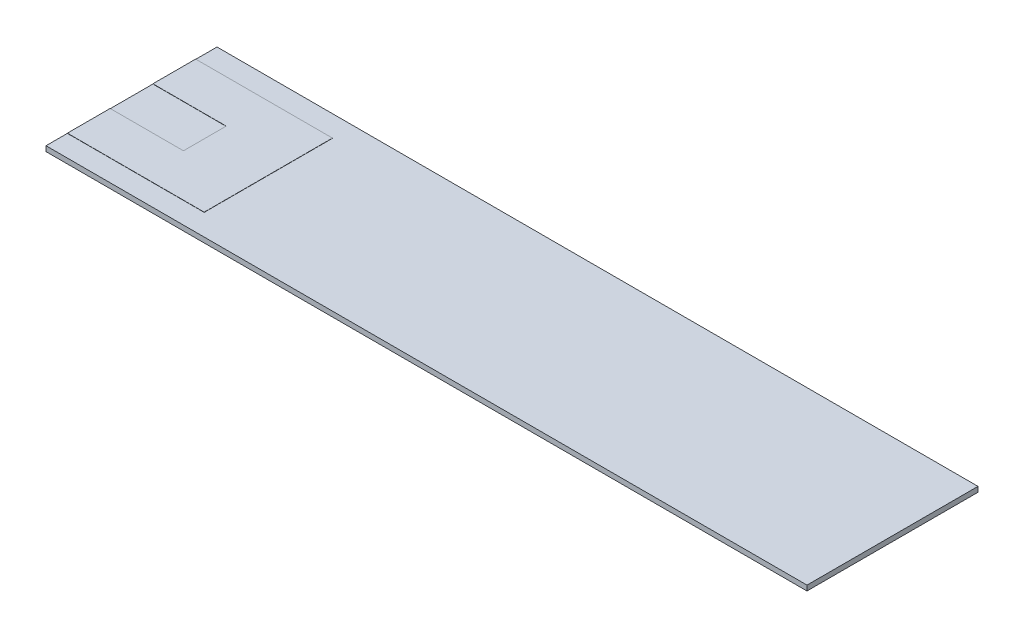
ISO-10303-21;
HEADER;
FILE_DESCRIPTION(('STEP AP214'),'2;1');
FILE_NAME('part.step','',(''),(''),'','','');
FILE_SCHEMA(('AUTOMOTIVE_DESIGN { 1 0 10303 214 1 1 1 1 }'));
ENDSEC;
DATA;
#1=APPLICATION_CONTEXT('core data for automotive mechanical design processes');
#2=APPLICATION_PROTOCOL_DEFINITION('international standard','automotive_design',2000,#1);
#3=PRODUCT_CONTEXT('',#1,'mechanical');
#4=PRODUCT('Part','Part','',(#3));
#5=PRODUCT_RELATED_PRODUCT_CATEGORY('part','',(#4));
#6=PRODUCT_DEFINITION_FORMATION('','',#4);
#7=PRODUCT_DEFINITION_CONTEXT('part definition',#1,'design');
#8=PRODUCT_DEFINITION('design','',#6,#7);
#9=PRODUCT_DEFINITION_SHAPE('','',#8);
#10=(LENGTH_UNIT() NAMED_UNIT(*) SI_UNIT(.MILLI.,.METRE.));
#11=(NAMED_UNIT(*) PLANE_ANGLE_UNIT() SI_UNIT($,.RADIAN.));
#12=(NAMED_UNIT(*) SI_UNIT($,.STERADIAN.) SOLID_ANGLE_UNIT());
#13=UNCERTAINTY_MEASURE_WITH_UNIT(LENGTH_MEASURE(1.E-05),#10,'distance_accuracy_value','');
#14=(GEOMETRIC_REPRESENTATION_CONTEXT(3) GLOBAL_UNCERTAINTY_ASSIGNED_CONTEXT((#13)) GLOBAL_UNIT_ASSIGNED_CONTEXT((#10,
#11,#12)) REPRESENTATION_CONTEXT('',''));
#15=CARTESIAN_POINT('',(0.,0.,0.));
#16=DIRECTION('',(0.,0.,1.));
#17=DIRECTION('',(1.,0.,0.));
#18=AXIS2_PLACEMENT_3D('',#15,#16,#17);
#19=CARTESIAN_POINT('',(0.,0.0001,0.));
#20=DIRECTION('',(0.,1.,0.));
#21=DIRECTION('',(0.,0.,1.));
#22=AXIS2_PLACEMENT_3D('',#19,#20,#21);
#23=PLANE('',#22);
#24=DIRECTION('',(-1.,0.,0.));
#25=VECTOR('',#24,1.);
#26=CARTESIAN_POINT('',(30.,0.0001,-3.75));
#27=LINE('',#26,#25);
#28=CARTESIAN_POINT('',(38.,0.0001,-3.75));
#29=VERTEX_POINT('',#28);
#30=CARTESIAN_POINT('',(30.,0.0001,-3.75));
#31=VERTEX_POINT('',#30);
#32=EDGE_CURVE('E50',#29,#31,#27,.T.);
#33=ORIENTED_EDGE('',*,*,#32,.F.);
#34=DIRECTION('',(0.,0.,-1.));
#35=VECTOR('',#34,1.);
#36=CARTESIAN_POINT('',(38.,0.0001,-3.75));
#37=LINE('',#36,#35);
#38=CARTESIAN_POINT('',(38.,0.0001,3.75));
#39=VERTEX_POINT('',#38);
#40=EDGE_CURVE('E54',#39,#29,#37,.T.);
#41=ORIENTED_EDGE('',*,*,#40,.F.);
#42=DIRECTION('',(1.,0.,0.));
#43=VECTOR('',#42,1.);
#44=CARTESIAN_POINT('',(38.,0.0001,3.75));
#45=LINE('',#44,#43);
#46=CARTESIAN_POINT('',(30.,0.0001,3.75));
#47=VERTEX_POINT('',#46);
#48=EDGE_CURVE('E197',#47,#39,#45,.T.);
#49=ORIENTED_EDGE('',*,*,#48,.F.);
#50=DIRECTION('',(0.,0.,1.));
#51=VECTOR('',#50,1.);
#52=CARTESIAN_POINT('',(30.,0.0001,-5.));
#53=LINE('',#52,#51);
#54=CARTESIAN_POINT('',(30.,0.0001,5.));
#55=VERTEX_POINT('',#54);
#56=EDGE_CURVE('E162',#47,#55,#53,.T.);
#57=ORIENTED_EDGE('',*,*,#56,.T.);
#58=DIRECTION('',(1.,0.,0.));
#59=VECTOR('',#58,1.);
#60=CARTESIAN_POINT('',(30.,0.0001,5.));
#61=LINE('',#60,#59);
#62=CARTESIAN_POINT('',(74.5,0.0001,5.));
#63=VERTEX_POINT('',#62);
#64=EDGE_CURVE('E165',#55,#63,#61,.T.);
#65=ORIENTED_EDGE('',*,*,#64,.T.);
#66=DIRECTION('',(0.,0.,-1.));
#67=VECTOR('',#66,1.);
#68=CARTESIAN_POINT('',(74.5,0.0001,-5.));
#69=LINE('',#68,#67);
#70=CARTESIAN_POINT('',(74.5,0.0001,-5.));
#71=VERTEX_POINT('',#70);
#72=EDGE_CURVE('E167',#63,#71,#69,.T.);
#73=ORIENTED_EDGE('',*,*,#72,.T.);
#74=DIRECTION('',(-1.,0.,0.));
#75=VECTOR('',#74,1.);
#76=CARTESIAN_POINT('',(30.,0.0001,-5.));
#77=LINE('',#76,#75);
#78=CARTESIAN_POINT('',(30.,0.0001,-5.));
#79=VERTEX_POINT('',#78);
#80=EDGE_CURVE('E169',#71,#79,#77,.T.);
#81=ORIENTED_EDGE('',*,*,#80,.T.);
#82=EDGE_CURVE('E163',#79,#31,#53,.T.);
#83=ORIENTED_EDGE('',*,*,#82,.T.);
#84=EDGE_LOOP('',(#33,#41,#49,#57,#65,#73,#81,#83));
#85=FACE_BOUND('',#84,.T.);
#86=ADVANCED_FACE('F35',(#85),#23,.T.);
#87=CARTESIAN_POINT('',(30.,0.0001,-5.));
#88=DIRECTION('',(1.,0.,0.));
#89=DIRECTION('',(0.,0.,-1.));
#90=AXIS2_PLACEMENT_3D('',#87,#88,#89);
#91=PLANE('',#90);
#92=DIRECTION('',(0.,-1.,0.));
#93=VECTOR('',#92,1.);
#94=CARTESIAN_POINT('',(30.,0.0001,-5.));
#95=LINE('',#94,#93);
#96=CARTESIAN_POINT('',(30.,-0.3,-5.));
#97=VERTEX_POINT('',#96);
#98=EDGE_CURVE('E171',#79,#97,#95,.T.);
#99=ORIENTED_EDGE('',*,*,#98,.T.);
#100=DIRECTION('',(0.,0.,1.));
#101=VECTOR('',#100,1.);
#102=CARTESIAN_POINT('',(30.,-0.3,-5.));
#103=LINE('',#102,#101);
#104=CARTESIAN_POINT('',(30.,-0.3,5.));
#105=VERTEX_POINT('',#104);
#106=EDGE_CURVE('E145',#97,#105,#103,.T.);
#107=ORIENTED_EDGE('',*,*,#106,.T.);
#108=DIRECTION('',(0.,-1.,0.));
#109=VECTOR('',#108,1.);
#110=CARTESIAN_POINT('',(30.,0.0001,5.));
#111=LINE('',#110,#109);
#112=EDGE_CURVE('E11',#55,#105,#111,.T.);
#113=ORIENTED_EDGE('',*,*,#112,.F.);
#114=ORIENTED_EDGE('',*,*,#56,.F.);
#115=DIRECTION('',(0.,-1.,0.));
#116=VECTOR('',#115,1.);
#117=CARTESIAN_POINT('',(30.,0.0127,3.75));
#118=LINE('',#117,#116);
#119=CARTESIAN_POINT('',(30.,0.0127,3.75));
#120=VERTEX_POINT('',#119);
#121=EDGE_CURVE('E215',#120,#47,#118,.T.);
#122=ORIENTED_EDGE('',*,*,#121,.F.);
#123=DIRECTION('',(0.,0.,1.));
#124=VECTOR('',#123,1.);
#125=CARTESIAN_POINT('',(30.,0.0127,1.25));
#126=LINE('',#125,#124);
#127=CARTESIAN_POINT('',(30.,0.0127,1.25));
#128=VERTEX_POINT('',#127);
#129=EDGE_CURVE('E214',#128,#120,#126,.T.);
#130=ORIENTED_EDGE('',*,*,#129,.F.);
#131=DIRECTION('',(0.,-1.,0.));
#132=VECTOR('',#131,1.);
#133=CARTESIAN_POINT('',(30.,0.0127,1.25));
#134=LINE('',#133,#132);
#135=CARTESIAN_POINT('',(30.,0.0001,1.25));
#136=VERTEX_POINT('',#135);
#137=EDGE_CURVE('E209',#128,#136,#134,.T.);
#138=ORIENTED_EDGE('',*,*,#137,.T.);
#139=CARTESIAN_POINT('',(30.,0.0001,-1.25));
#140=VERTEX_POINT('',#139);
#141=EDGE_CURVE('E144',#140,#136,#53,.T.);
#142=ORIENTED_EDGE('',*,*,#141,.F.);
#143=DIRECTION('',(0.,-1.,0.));
#144=VECTOR('',#143,1.);
#145=CARTESIAN_POINT('',(30.,0.0127,-1.25));
#146=LINE('',#145,#144);
#147=CARTESIAN_POINT('',(30.,0.0127,-1.25));
#148=VERTEX_POINT('',#147);
#149=EDGE_CURVE('E126',#148,#140,#146,.T.);
#150=ORIENTED_EDGE('',*,*,#149,.F.);
#151=DIRECTION('',(0.,0.,1.));
#152=VECTOR('',#151,1.);
#153=CARTESIAN_POINT('',(30.,0.0127,-3.75));
#154=LINE('',#153,#152);
#155=CARTESIAN_POINT('',(30.,0.0127,-3.75));
#156=VERTEX_POINT('',#155);
#157=EDGE_CURVE('E132',#156,#148,#154,.T.);
#158=ORIENTED_EDGE('',*,*,#157,.F.);
#159=DIRECTION('',(0.,-1.,0.));
#160=VECTOR('',#159,1.);
#161=CARTESIAN_POINT('',(30.,0.0127,-3.75));
#162=LINE('',#161,#160);
#163=EDGE_CURVE('E225',#156,#31,#162,.T.);
#164=ORIENTED_EDGE('',*,*,#163,.T.);
#165=ORIENTED_EDGE('',*,*,#82,.F.);
#166=EDGE_LOOP('',(#99,#107,#113,#114,#122,#130,#138,#142,#150,#158,#164,#165));
#167=FACE_BOUND('',#166,.T.);
#168=ADVANCED_FACE('F37',(#167),#91,.F.);
#169=CARTESIAN_POINT('',(30.,0.0001,5.));
#170=DIRECTION('',(0.,0.,-1.));
#171=DIRECTION('',(-1.,0.,0.));
#172=AXIS2_PLACEMENT_3D('',#169,#170,#171);
#173=PLANE('',#172);
#174=ORIENTED_EDGE('',*,*,#112,.T.);
#175=DIRECTION('',(1.,0.,0.));
#176=VECTOR('',#175,1.);
#177=CARTESIAN_POINT('',(30.,-0.3,5.));
#178=LINE('',#177,#176);
#179=CARTESIAN_POINT('',(74.5,-0.3,5.));
#180=VERTEX_POINT('',#179);
#181=EDGE_CURVE('E148',#105,#180,#178,.T.);
#182=ORIENTED_EDGE('',*,*,#181,.T.);
#183=DIRECTION('',(0.,-1.,0.));
#184=VECTOR('',#183,1.);
#185=CARTESIAN_POINT('',(74.5,0.0001,5.));
#186=LINE('',#185,#184);
#187=EDGE_CURVE('E43',#63,#180,#186,.T.);
#188=ORIENTED_EDGE('',*,*,#187,.F.);
#189=ORIENTED_EDGE('',*,*,#64,.F.);
#190=EDGE_LOOP('',(#174,#182,#188,#189));
#191=FACE_BOUND('',#190,.T.);
#192=ADVANCED_FACE('F187',(#191),#173,.F.);
#193=CARTESIAN_POINT('',(74.5,0.0001,-5.));
#194=DIRECTION('',(-1.,0.,0.));
#195=DIRECTION('',(0.,0.,1.));
#196=AXIS2_PLACEMENT_3D('',#193,#194,#195);
#197=PLANE('',#196);
#198=ORIENTED_EDGE('',*,*,#187,.T.);
#199=DIRECTION('',(0.,0.,-1.));
#200=VECTOR('',#199,1.);
#201=CARTESIAN_POINT('',(74.5,-0.3,-5.));
#202=LINE('',#201,#200);
#203=CARTESIAN_POINT('',(74.5,-0.3,-5.));
#204=VERTEX_POINT('',#203);
#205=EDGE_CURVE('E156',#180,#204,#202,.T.);
#206=ORIENTED_EDGE('',*,*,#205,.T.);
#207=DIRECTION('',(0.,-1.,0.));
#208=VECTOR('',#207,1.);
#209=CARTESIAN_POINT('',(74.5,0.0001,-5.));
#210=LINE('',#209,#208);
#211=EDGE_CURVE('E173',#71,#204,#210,.T.);
#212=ORIENTED_EDGE('',*,*,#211,.F.);
#213=ORIENTED_EDGE('',*,*,#72,.F.);
#214=EDGE_LOOP('',(#198,#206,#212,#213));
#215=FACE_BOUND('',#214,.T.);
#216=ADVANCED_FACE('F178',(#215),#197,.F.);
#217=CARTESIAN_POINT('',(30.,0.0001,-5.));
#218=DIRECTION('',(0.,0.,1.));
#219=DIRECTION('',(1.,0.,0.));
#220=AXIS2_PLACEMENT_3D('',#217,#218,#219);
#221=PLANE('',#220);
#222=ORIENTED_EDGE('',*,*,#211,.T.);
#223=DIRECTION('',(-1.,0.,0.));
#224=VECTOR('',#223,1.);
#225=CARTESIAN_POINT('',(30.,-0.3,-5.));
#226=LINE('',#225,#224);
#227=EDGE_CURVE('E159',#204,#97,#226,.T.);
#228=ORIENTED_EDGE('',*,*,#227,.T.);
#229=ORIENTED_EDGE('',*,*,#98,.F.);
#230=ORIENTED_EDGE('',*,*,#80,.F.);
#231=EDGE_LOOP('',(#222,#228,#229,#230));
#232=FACE_BOUND('',#231,.T.);
#233=ADVANCED_FACE('F195',(#232),#221,.F.);
#234=DIRECTION('',(-1.,0.,0.));
#235=VECTOR('',#234,1.);
#236=CARTESIAN_POINT('',(30.,0.0001,1.25));
#237=LINE('',#236,#235);
#238=CARTESIAN_POINT('',(34.2882611147377,0.0001,1.25));
#239=VERTEX_POINT('',#238);
#240=EDGE_CURVE('E201',#239,#136,#237,.T.);
#241=ORIENTED_EDGE('',*,*,#240,.F.);
#242=DIRECTION('',(0.,0.,1.));
#243=VECTOR('',#242,1.);
#244=CARTESIAN_POINT('',(34.2882611147377,0.0001,1.25));
#245=LINE('',#244,#243);
#246=CARTESIAN_POINT('',(34.2882611147377,0.0001,-1.25));
#247=VERTEX_POINT('',#246);
#248=EDGE_CURVE('E212',#247,#239,#245,.T.);
#249=ORIENTED_EDGE('',*,*,#248,.F.);
#250=DIRECTION('',(1.,0.,0.));
#251=VECTOR('',#250,1.);
#252=CARTESIAN_POINT('',(34.2882611147377,0.0001,-1.25));
#253=LINE('',#252,#251);
#254=EDGE_CURVE('E203',#140,#247,#253,.T.);
#255=ORIENTED_EDGE('',*,*,#254,.F.);
#256=ORIENTED_EDGE('',*,*,#141,.T.);
#257=EDGE_LOOP('',(#241,#249,#255,#256));
#258=FACE_BOUND('',#257,.T.);
#259=ADVANCED_FACE('F200',(#258),#23,.T.);
#260=CARTESIAN_POINT('',(0.,-0.3,0.));
#261=DIRECTION('',(0.,1.,0.));
#262=DIRECTION('',(0.,0.,1.));
#263=AXIS2_PLACEMENT_3D('',#260,#261,#262);
#264=PLANE('',#263);
#265=ORIENTED_EDGE('',*,*,#106,.F.);
#266=ORIENTED_EDGE('',*,*,#227,.F.);
#267=ORIENTED_EDGE('',*,*,#205,.F.);
#268=ORIENTED_EDGE('',*,*,#181,.F.);
#269=EDGE_LOOP('',(#265,#266,#267,#268));
#270=FACE_BOUND('',#269,.T.);
#271=ADVANCED_FACE('F186',(#270),#264,.F.);
#272=CARTESIAN_POINT('',(34.2882611147377,0.0127,-1.25));
#273=DIRECTION('',(0.,0.,-1.));
#274=DIRECTION('',(-1.,0.,0.));
#275=AXIS2_PLACEMENT_3D('',#272,#273,#274);
#276=PLANE('',#275);
#277=ORIENTED_EDGE('',*,*,#254,.T.);
#278=DIRECTION('',(0.,-1.,0.));
#279=VECTOR('',#278,1.);
#280=CARTESIAN_POINT('',(34.2882611147377,0.0127,-1.25));
#281=LINE('',#280,#279);
#282=CARTESIAN_POINT('',(34.2882611147377,0.0127,-1.25));
#283=VERTEX_POINT('',#282);
#284=EDGE_CURVE('E128',#283,#247,#281,.T.);
#285=ORIENTED_EDGE('',*,*,#284,.F.);
#286=DIRECTION('',(1.,0.,0.));
#287=VECTOR('',#286,1.);
#288=CARTESIAN_POINT('',(34.2882611147377,0.0127,-1.25));
#289=LINE('',#288,#287);
#290=EDGE_CURVE('E121',#148,#283,#289,.T.);
#291=ORIENTED_EDGE('',*,*,#290,.F.);
#292=ORIENTED_EDGE('',*,*,#149,.T.);
#293=EDGE_LOOP('',(#277,#285,#291,#292));
#294=FACE_BOUND('',#293,.T.);
#295=ADVANCED_FACE('F124',(#294),#276,.F.);
#296=CARTESIAN_POINT('',(34.2882611147377,0.0127,1.25));
#297=DIRECTION('',(1.,0.,0.));
#298=DIRECTION('',(0.,0.,-1.));
#299=AXIS2_PLACEMENT_3D('',#296,#297,#298);
#300=PLANE('',#299);
#301=ORIENTED_EDGE('',*,*,#248,.T.);
#302=DIRECTION('',(0.,-1.,0.));
#303=VECTOR('',#302,1.);
#304=CARTESIAN_POINT('',(34.2882611147377,0.0127,1.25));
#305=LINE('',#304,#303);
#306=CARTESIAN_POINT('',(34.2882611147377,0.0127,1.25));
#307=VERTEX_POINT('',#306);
#308=EDGE_CURVE('E150',#307,#239,#305,.T.);
#309=ORIENTED_EDGE('',*,*,#308,.F.);
#310=DIRECTION('',(0.,0.,1.));
#311=VECTOR('',#310,1.);
#312=CARTESIAN_POINT('',(34.2882611147377,0.0127,1.25));
#313=LINE('',#312,#311);
#314=EDGE_CURVE('E131',#283,#307,#313,.T.);
#315=ORIENTED_EDGE('',*,*,#314,.F.);
#316=ORIENTED_EDGE('',*,*,#284,.T.);
#317=EDGE_LOOP('',(#301,#309,#315,#316));
#318=FACE_BOUND('',#317,.T.);
#319=ADVANCED_FACE('F241',(#318),#300,.F.);
#320=CARTESIAN_POINT('',(30.,0.0127,1.25));
#321=DIRECTION('',(0.,0.,1.));
#322=DIRECTION('',(1.,0.,0.));
#323=AXIS2_PLACEMENT_3D('',#320,#321,#322);
#324=PLANE('',#323);
#325=ORIENTED_EDGE('',*,*,#240,.T.);
#326=ORIENTED_EDGE('',*,*,#137,.F.);
#327=DIRECTION('',(-1.,0.,0.));
#328=VECTOR('',#327,1.);
#329=CARTESIAN_POINT('',(30.,0.0127,1.25));
#330=LINE('',#329,#328);
#331=EDGE_CURVE('E238',#307,#128,#330,.T.);
#332=ORIENTED_EDGE('',*,*,#331,.F.);
#333=ORIENTED_EDGE('',*,*,#308,.T.);
#334=EDGE_LOOP('',(#325,#326,#332,#333));
#335=FACE_BOUND('',#334,.T.);
#336=ADVANCED_FACE('F207',(#335),#324,.F.);
#337=CARTESIAN_POINT('',(38.,0.0127,3.75));
#338=DIRECTION('',(0.,0.,-1.));
#339=DIRECTION('',(-1.,0.,0.));
#340=AXIS2_PLACEMENT_3D('',#337,#338,#339);
#341=PLANE('',#340);
#342=ORIENTED_EDGE('',*,*,#48,.T.);
#343=DIRECTION('',(0.,-1.,0.));
#344=VECTOR('',#343,1.);
#345=CARTESIAN_POINT('',(38.,0.0127,3.75));
#346=LINE('',#345,#344);
#347=CARTESIAN_POINT('',(38.,0.0127,3.75));
#348=VERTEX_POINT('',#347);
#349=EDGE_CURVE('E217',#348,#39,#346,.T.);
#350=ORIENTED_EDGE('',*,*,#349,.F.);
#351=DIRECTION('',(1.,0.,0.));
#352=VECTOR('',#351,1.);
#353=CARTESIAN_POINT('',(38.,0.0127,3.75));
#354=LINE('',#353,#352);
#355=EDGE_CURVE('E235',#120,#348,#354,.T.);
#356=ORIENTED_EDGE('',*,*,#355,.F.);
#357=ORIENTED_EDGE('',*,*,#121,.T.);
#358=EDGE_LOOP('',(#342,#350,#356,#357));
#359=FACE_BOUND('',#358,.T.);
#360=ADVANCED_FACE('F248',(#359),#341,.F.);
#361=CARTESIAN_POINT('',(38.,0.0127,-3.75));
#362=DIRECTION('',(-1.,0.,0.));
#363=DIRECTION('',(0.,0.,1.));
#364=AXIS2_PLACEMENT_3D('',#361,#362,#363);
#365=PLANE('',#364);
#366=ORIENTED_EDGE('',*,*,#40,.T.);
#367=DIRECTION('',(0.,-1.,0.));
#368=VECTOR('',#367,1.);
#369=CARTESIAN_POINT('',(38.,0.0127,-3.75));
#370=LINE('',#369,#368);
#371=CARTESIAN_POINT('',(38.,0.0127,-3.75));
#372=VERTEX_POINT('',#371);
#373=EDGE_CURVE('E222',#372,#29,#370,.T.);
#374=ORIENTED_EDGE('',*,*,#373,.F.);
#375=DIRECTION('',(0.,0.,-1.));
#376=VECTOR('',#375,1.);
#377=CARTESIAN_POINT('',(38.,0.0127,-3.75));
#378=LINE('',#377,#376);
#379=EDGE_CURVE('E233',#348,#372,#378,.T.);
#380=ORIENTED_EDGE('',*,*,#379,.F.);
#381=ORIENTED_EDGE('',*,*,#349,.T.);
#382=EDGE_LOOP('',(#366,#374,#380,#381));
#383=FACE_BOUND('',#382,.T.);
#384=ADVANCED_FACE('F324',(#383),#365,.F.);
#385=CARTESIAN_POINT('',(30.,0.0127,-3.75));
#386=DIRECTION('',(0.,0.,1.));
#387=DIRECTION('',(1.,0.,0.));
#388=AXIS2_PLACEMENT_3D('',#385,#386,#387);
#389=PLANE('',#388);
#390=ORIENTED_EDGE('',*,*,#32,.T.);
#391=ORIENTED_EDGE('',*,*,#163,.F.);
#392=DIRECTION('',(-1.,0.,0.));
#393=VECTOR('',#392,1.);
#394=CARTESIAN_POINT('',(30.,0.0127,-3.75));
#395=LINE('',#394,#393);
#396=EDGE_CURVE('E137',#372,#156,#395,.T.);
#397=ORIENTED_EDGE('',*,*,#396,.F.);
#398=ORIENTED_EDGE('',*,*,#373,.T.);
#399=EDGE_LOOP('',(#390,#391,#397,#398));
#400=FACE_BOUND('',#399,.T.);
#401=ADVANCED_FACE('F334',(#400),#389,.F.);
#402=CARTESIAN_POINT('',(0.,0.0127,0.));
#403=DIRECTION('',(0.,-1.,0.));
#404=DIRECTION('',(0.,0.,-1.));
#405=AXIS2_PLACEMENT_3D('',#402,#403,#404);
#406=PLANE('',#405);
#407=ORIENTED_EDGE('',*,*,#157,.T.);
#408=ORIENTED_EDGE('',*,*,#290,.T.);
#409=ORIENTED_EDGE('',*,*,#314,.T.);
#410=ORIENTED_EDGE('',*,*,#331,.T.);
#411=ORIENTED_EDGE('',*,*,#129,.T.);
#412=ORIENTED_EDGE('',*,*,#355,.T.);
#413=ORIENTED_EDGE('',*,*,#379,.T.);
#414=ORIENTED_EDGE('',*,*,#396,.T.);
#415=EDGE_LOOP('',(#407,#408,#409,#410,#411,#412,#413,#414));
#416=FACE_BOUND('',#415,.T.);
#417=ADVANCED_FACE('F135',(#416),#406,.F.);
#418=CLOSED_SHELL('',(#86,#168,#192,#216,#233,#259,#271,#295,#319,#336,#360,#384,#401,#417));
#419=MANIFOLD_SOLID_BREP('B2',#418);
#420=ADVANCED_BREP_SHAPE_REPRESENTATION('',(#18,#419),#14);
#421=SHAPE_DEFINITION_REPRESENTATION(#9,#420);
ENDSEC;
END-ISO-10303-21;
